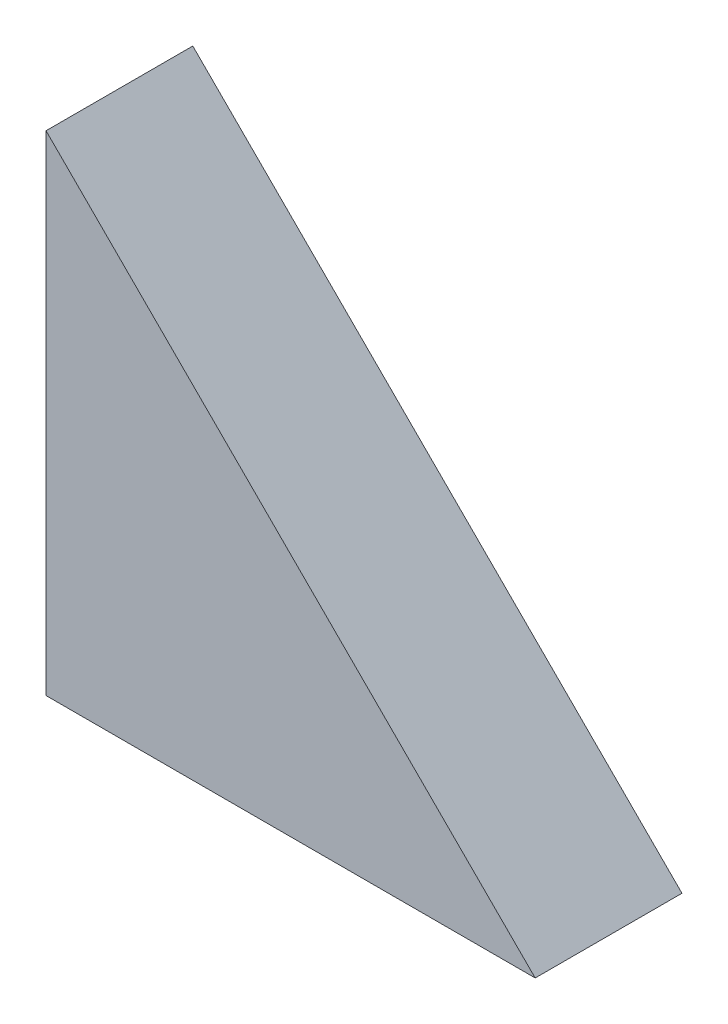
ISO-10303-21;
HEADER;
FILE_DESCRIPTION(('STEP AP214'),'2;1');
FILE_NAME('part.step','',(''),(''),'','','');
FILE_SCHEMA(('AUTOMOTIVE_DESIGN { 1 0 10303 214 1 1 1 1 }'));
ENDSEC;
DATA;
#1=APPLICATION_CONTEXT('core data for automotive mechanical design processes');
#2=APPLICATION_PROTOCOL_DEFINITION('international standard','automotive_design',2000,#1);
#3=PRODUCT_CONTEXT('',#1,'mechanical');
#4=PRODUCT('Part','Part','',(#3));
#5=PRODUCT_RELATED_PRODUCT_CATEGORY('part','',(#4));
#6=PRODUCT_DEFINITION_FORMATION('','',#4);
#7=PRODUCT_DEFINITION_CONTEXT('part definition',#1,'design');
#8=PRODUCT_DEFINITION('design','',#6,#7);
#9=PRODUCT_DEFINITION_SHAPE('','',#8);
#10=(LENGTH_UNIT() NAMED_UNIT(*) SI_UNIT(.MILLI.,.METRE.));
#11=(NAMED_UNIT(*) PLANE_ANGLE_UNIT() SI_UNIT($,.RADIAN.));
#12=(NAMED_UNIT(*) SI_UNIT($,.STERADIAN.) SOLID_ANGLE_UNIT());
#13=UNCERTAINTY_MEASURE_WITH_UNIT(LENGTH_MEASURE(1.E-05),#10,'distance_accuracy_value','');
#14=(GEOMETRIC_REPRESENTATION_CONTEXT(3) GLOBAL_UNCERTAINTY_ASSIGNED_CONTEXT((#13)) GLOBAL_UNIT_ASSIGNED_CONTEXT((#10,
#11,#12)) REPRESENTATION_CONTEXT('',''));
#15=CARTESIAN_POINT('',(0.,0.,0.));
#16=DIRECTION('',(0.,0.,1.));
#17=DIRECTION('',(1.,0.,0.));
#18=AXIS2_PLACEMENT_3D('',#15,#16,#17);
#19=CARTESIAN_POINT('',(27.3910594650107,54.822011304901,9.525));
#20=DIRECTION('',(-0.707106781186548,-0.707106781186548,0.));
#21=DIRECTION('',(0.707106781186548,-0.707106781186548,0.));
#22=AXIS2_PLACEMENT_3D('',#19,#20,#21);
#23=PLANE('',#22);
#24=DIRECTION('',(-0.707106781186548,0.707106781186548,0.));
#25=VECTOR('',#24,1.);
#26=CARTESIAN_POINT('',(27.3910594650107,54.822011304901,-9.525));
#27=LINE('',#26,#25);
#28=CARTESIAN_POINT('',(27.3910594650107,54.822011304901,-9.525));
#29=VERTEX_POINT('',#28);
#30=CARTESIAN_POINT('',(-36.1089405349893,118.322011304901,-9.525));
#31=VERTEX_POINT('',#30);
#32=EDGE_CURVE('E82',#29,#31,#27,.T.);
#33=ORIENTED_EDGE('',*,*,#32,.T.);
#34=DIRECTION('',(0.,0.,-1.));
#35=VECTOR('',#34,1.);
#36=CARTESIAN_POINT('',(-36.1089405349893,118.322011304901,9.525));
#37=LINE('',#36,#35);
#38=CARTESIAN_POINT('',(-36.1089405349893,118.322011304901,9.525));
#39=VERTEX_POINT('',#38);
#40=EDGE_CURVE('E11',#39,#31,#37,.T.);
#41=ORIENTED_EDGE('',*,*,#40,.F.);
#42=DIRECTION('',(-0.707106781186548,0.707106781186548,0.));
#43=VECTOR('',#42,1.);
#44=CARTESIAN_POINT('',(27.3910594650107,54.822011304901,9.525));
#45=LINE('',#44,#43);
#46=CARTESIAN_POINT('',(27.3910594650107,54.822011304901,9.525));
#47=VERTEX_POINT('',#46);
#48=EDGE_CURVE('E75',#47,#39,#45,.T.);
#49=ORIENTED_EDGE('',*,*,#48,.F.);
#50=DIRECTION('',(0.,0.,-1.));
#51=VECTOR('',#50,1.);
#52=CARTESIAN_POINT('',(27.3910594650107,54.822011304901,9.525));
#53=LINE('',#52,#51);
#54=EDGE_CURVE('E83',#47,#29,#53,.T.);
#55=ORIENTED_EDGE('',*,*,#54,.T.);
#56=EDGE_LOOP('',(#33,#41,#49,#55));
#57=FACE_BOUND('',#56,.T.);
#58=ADVANCED_FACE('F35',(#57),#23,.F.);
#59=CARTESIAN_POINT('',(-36.1089405349893,118.322011304901,9.525));
#60=DIRECTION('',(1.,0.,0.));
#61=DIRECTION('',(0.,0.,-1.));
#62=AXIS2_PLACEMENT_3D('',#59,#60,#61);
#63=PLANE('',#62);
#64=DIRECTION('',(0.,-1.,0.));
#65=VECTOR('',#64,1.);
#66=CARTESIAN_POINT('',(-36.1089405349893,118.322011304901,-9.525));
#67=LINE('',#66,#65);
#68=CARTESIAN_POINT('',(-36.1089405349893,54.822011304901,-9.525));
#69=VERTEX_POINT('',#68);
#70=EDGE_CURVE('E63',#31,#69,#67,.T.);
#71=ORIENTED_EDGE('',*,*,#70,.T.);
#72=DIRECTION('',(0.,0.,-1.));
#73=VECTOR('',#72,1.);
#74=CARTESIAN_POINT('',(-36.1089405349893,54.822011304901,9.525));
#75=LINE('',#74,#73);
#76=CARTESIAN_POINT('',(-36.1089405349893,54.822011304901,9.525));
#77=VERTEX_POINT('',#76);
#78=EDGE_CURVE('E43',#77,#69,#75,.T.);
#79=ORIENTED_EDGE('',*,*,#78,.F.);
#80=DIRECTION('',(0.,-1.,0.));
#81=VECTOR('',#80,1.);
#82=CARTESIAN_POINT('',(-36.1089405349893,118.322011304901,9.525));
#83=LINE('',#82,#81);
#84=EDGE_CURVE('E71',#39,#77,#83,.T.);
#85=ORIENTED_EDGE('',*,*,#84,.F.);
#86=ORIENTED_EDGE('',*,*,#40,.T.);
#87=EDGE_LOOP('',(#71,#79,#85,#86));
#88=FACE_BOUND('',#87,.T.);
#89=ADVANCED_FACE('F72',(#88),#63,.F.);
#90=CARTESIAN_POINT('',(-36.1089405349893,54.822011304901,9.525));
#91=DIRECTION('',(0.,1.,0.));
#92=DIRECTION('',(0.,0.,1.));
#93=AXIS2_PLACEMENT_3D('',#90,#91,#92);
#94=PLANE('',#93);
#95=DIRECTION('',(1.,0.,0.));
#96=VECTOR('',#95,1.);
#97=CARTESIAN_POINT('',(-36.1089405349893,54.822011304901,-9.525));
#98=LINE('',#97,#96);
#99=EDGE_CURVE('E68',#69,#29,#98,.T.);
#100=ORIENTED_EDGE('',*,*,#99,.T.);
#101=ORIENTED_EDGE('',*,*,#54,.F.);
#102=DIRECTION('',(1.,0.,0.));
#103=VECTOR('',#102,1.);
#104=CARTESIAN_POINT('',(-36.1089405349893,54.822011304901,9.525));
#105=LINE('',#104,#103);
#106=EDGE_CURVE('E51',#77,#47,#105,.T.);
#107=ORIENTED_EDGE('',*,*,#106,.F.);
#108=ORIENTED_EDGE('',*,*,#78,.T.);
#109=EDGE_LOOP('',(#100,#101,#107,#108));
#110=FACE_BOUND('',#109,.T.);
#111=ADVANCED_FACE('F93',(#110),#94,.F.);
#112=CARTESIAN_POINT('',(0.,0.,9.525));
#113=DIRECTION('',(0.,0.,1.));
#114=DIRECTION('',(1.,0.,0.));
#115=AXIS2_PLACEMENT_3D('',#112,#113,#114);
#116=PLANE('',#115);
#117=ORIENTED_EDGE('',*,*,#48,.T.);
#118=ORIENTED_EDGE('',*,*,#84,.T.);
#119=ORIENTED_EDGE('',*,*,#106,.T.);
#120=EDGE_LOOP('',(#117,#118,#119));
#121=FACE_BOUND('',#120,.T.);
#122=ADVANCED_FACE('F78',(#121),#116,.T.);
#123=CARTESIAN_POINT('',(0.,0.,-9.525));
#124=DIRECTION('',(0.,0.,1.));
#125=DIRECTION('',(1.,0.,0.));
#126=AXIS2_PLACEMENT_3D('',#123,#124,#125);
#127=PLANE('',#126);
#128=ORIENTED_EDGE('',*,*,#32,.F.);
#129=ORIENTED_EDGE('',*,*,#99,.F.);
#130=ORIENTED_EDGE('',*,*,#70,.F.);
#131=EDGE_LOOP('',(#128,#129,#130));
#132=FACE_BOUND('',#131,.T.);
#133=ADVANCED_FACE('F94',(#132),#127,.F.);
#134=CLOSED_SHELL('',(#58,#89,#111,#122,#133));
#135=MANIFOLD_SOLID_BREP('B2',#134);
#136=ADVANCED_BREP_SHAPE_REPRESENTATION('',(#18,#135),#14);
#137=SHAPE_DEFINITION_REPRESENTATION(#9,#136);
ENDSEC;
END-ISO-10303-21;
